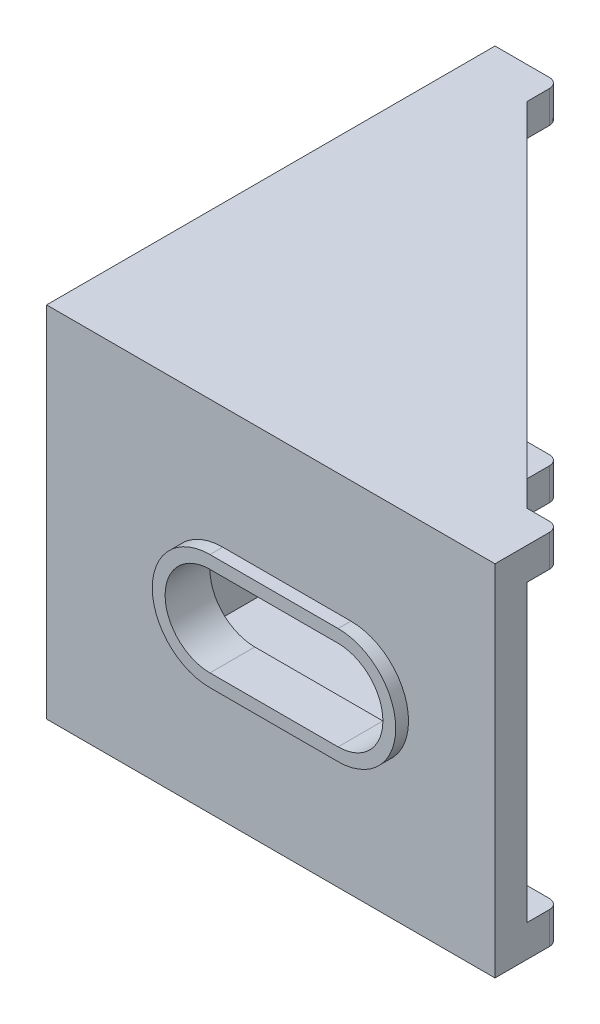
ISO-10303-21;
HEADER;
FILE_DESCRIPTION(('STEP AP214'),'2;1');
FILE_NAME('part.step','',(''),(''),'','','');
FILE_SCHEMA(('AUTOMOTIVE_DESIGN { 1 0 10303 214 1 1 1 1 }'));
ENDSEC;
DATA;
#1=APPLICATION_CONTEXT('core data for automotive mechanical design processes');
#2=APPLICATION_PROTOCOL_DEFINITION('international standard','automotive_design',2000,#1);
#3=PRODUCT_CONTEXT('',#1,'mechanical');
#4=PRODUCT('Part','Part','',(#3));
#5=PRODUCT_RELATED_PRODUCT_CATEGORY('part','',(#4));
#6=PRODUCT_DEFINITION_FORMATION('','',#4);
#7=PRODUCT_DEFINITION_CONTEXT('part definition',#1,'design');
#8=PRODUCT_DEFINITION('design','',#6,#7);
#9=PRODUCT_DEFINITION_SHAPE('','',#8);
#10=(LENGTH_UNIT() NAMED_UNIT(*) SI_UNIT(.MILLI.,.METRE.));
#11=(NAMED_UNIT(*) PLANE_ANGLE_UNIT() SI_UNIT($,.RADIAN.));
#12=(NAMED_UNIT(*) SI_UNIT($,.STERADIAN.) SOLID_ANGLE_UNIT());
#13=UNCERTAINTY_MEASURE_WITH_UNIT(LENGTH_MEASURE(1.E-05),#10,'distance_accuracy_value','');
#14=(GEOMETRIC_REPRESENTATION_CONTEXT(3) GLOBAL_UNCERTAINTY_ASSIGNED_CONTEXT((#13)) GLOBAL_UNIT_ASSIGNED_CONTEXT((#10,
#11,#12)) REPRESENTATION_CONTEXT('',''));
#15=CARTESIAN_POINT('',(0.,0.,0.));
#16=DIRECTION('',(0.,0.,1.));
#17=DIRECTION('',(1.,0.,0.));
#18=AXIS2_PLACEMENT_3D('',#15,#16,#17);
#19=CARTESIAN_POINT('',(0.,28.,0.));
#20=DIRECTION('',(0.,0.,-1.));
#21=DIRECTION('',(-1.,0.,0.));
#22=AXIS2_PLACEMENT_3D('',#19,#20,#21);
#23=PLANE('',#22);
#24=DIRECTION('',(1.,0.,0.));
#25=VECTOR('',#24,1.);
#26=CARTESIAN_POINT('',(0.,0.,0.));
#27=LINE('',#26,#25);
#28=CARTESIAN_POINT('',(0.,0.,0.));
#29=VERTEX_POINT('',#28);
#30=CARTESIAN_POINT('',(35.,0.,0.));
#31=VERTEX_POINT('',#30);
#32=EDGE_CURVE('E435',#29,#31,#27,.T.);
#33=ORIENTED_EDGE('',*,*,#32,.T.);
#34=DIRECTION('',(0.,-1.,0.));
#35=VECTOR('',#34,1.);
#36=CARTESIAN_POINT('',(35.,28.,0.));
#37=LINE('',#36,#35);
#38=CARTESIAN_POINT('',(35.,28.,0.));
#39=VERTEX_POINT('',#38);
#40=EDGE_CURVE('E11',#39,#31,#37,.T.);
#41=ORIENTED_EDGE('',*,*,#40,.F.);
#42=DIRECTION('',(1.,0.,0.));
#43=VECTOR('',#42,1.);
#44=CARTESIAN_POINT('',(0.,28.,0.));
#45=LINE('',#44,#43);
#46=CARTESIAN_POINT('',(0.,28.,0.));
#47=VERTEX_POINT('',#46);
#48=EDGE_CURVE('E446',#47,#39,#45,.T.);
#49=ORIENTED_EDGE('',*,*,#48,.F.);
#50=DIRECTION('',(0.,-1.,0.));
#51=VECTOR('',#50,1.);
#52=CARTESIAN_POINT('',(0.,28.,0.));
#53=LINE('',#52,#51);
#54=EDGE_CURVE('E456',#47,#29,#53,.T.);
#55=ORIENTED_EDGE('',*,*,#54,.T.);
#56=EDGE_LOOP('',(#33,#41,#49,#55));
#57=FACE_BOUND('',#56,.T.);
#58=CARTESIAN_POINT('',(13.75,14.,0.));
#59=DIRECTION('',(0.,0.,1.));
#60=DIRECTION('',(1.,0.,0.));
#61=AXIS2_PLACEMENT_3D('',#58,#59,#60);
#62=CIRCLE('',#61,4.5);
#63=CARTESIAN_POINT('',(13.75,18.5,0.));
#64=VERTEX_POINT('',#63);
#65=CARTESIAN_POINT('',(13.75,9.5,0.));
#66=VERTEX_POINT('',#65);
#67=EDGE_CURVE('E263',#64,#66,#62,.T.);
#68=ORIENTED_EDGE('',*,*,#67,.F.);
#69=DIRECTION('',(-1.,0.,0.));
#70=VECTOR('',#69,1.);
#71=CARTESIAN_POINT('',(13.75,18.5,0.));
#72=LINE('',#71,#70);
#73=CARTESIAN_POINT('',(23.75,18.5,0.));
#74=VERTEX_POINT('',#73);
#75=EDGE_CURVE('E268',#74,#64,#72,.T.);
#76=ORIENTED_EDGE('',*,*,#75,.F.);
#77=CARTESIAN_POINT('',(23.75,14.,0.));
#78=DIRECTION('',(0.,0.,1.));
#79=DIRECTION('',(1.,0.,0.));
#80=AXIS2_PLACEMENT_3D('',#77,#78,#79);
#81=CIRCLE('',#80,4.5);
#82=CARTESIAN_POINT('',(23.75,9.5,0.));
#83=VERTEX_POINT('',#82);
#84=EDGE_CURVE('E58',#83,#74,#81,.T.);
#85=ORIENTED_EDGE('',*,*,#84,.F.);
#86=DIRECTION('',(1.,0.,0.));
#87=VECTOR('',#86,1.);
#88=CARTESIAN_POINT('',(23.75,9.5,0.));
#89=LINE('',#88,#87);
#90=EDGE_CURVE('E53',#66,#83,#89,.T.);
#91=ORIENTED_EDGE('',*,*,#90,.F.);
#92=EDGE_LOOP('',(#68,#76,#85,#91));
#93=FACE_BOUND('',#92,.T.);
#94=ADVANCED_FACE('F39',(#57,#93),#23,.F.);
#95=CARTESIAN_POINT('',(2.5,28.,-2.5));
#96=DIRECTION('',(0.,0.,1.));
#97=DIRECTION('',(1.,0.,0.));
#98=AXIS2_PLACEMENT_3D('',#95,#96,#97);
#99=PLANE('',#98);
#100=DIRECTION('',(-1.,0.,0.));
#101=VECTOR('',#100,1.);
#102=CARTESIAN_POINT('',(23.75,10.5,-2.5));
#103=LINE('',#102,#101);
#104=CARTESIAN_POINT('',(23.75,10.5,-2.5));
#105=VERTEX_POINT('',#104);
#106=CARTESIAN_POINT('',(13.75,10.5,-2.5));
#107=VERTEX_POINT('',#106);
#108=EDGE_CURVE('E241',#105,#107,#103,.T.);
#109=ORIENTED_EDGE('',*,*,#108,.F.);
#110=CARTESIAN_POINT('',(23.75,14.,-2.5));
#111=DIRECTION('',(0.,0.,-1.));
#112=DIRECTION('',(-1.,0.,0.));
#113=AXIS2_PLACEMENT_3D('',#110,#111,#112);
#114=CIRCLE('',#113,3.5);
#115=CARTESIAN_POINT('',(23.75,17.5,-2.5));
#116=VERTEX_POINT('',#115);
#117=EDGE_CURVE('E317',#116,#105,#114,.T.);
#118=ORIENTED_EDGE('',*,*,#117,.F.);
#119=DIRECTION('',(1.,0.,0.));
#120=VECTOR('',#119,1.);
#121=CARTESIAN_POINT('',(23.75,17.5,-2.5));
#122=LINE('',#121,#120);
#123=CARTESIAN_POINT('',(13.75,17.5,-2.5));
#124=VERTEX_POINT('',#123);
#125=EDGE_CURVE('E328',#124,#116,#122,.T.);
#126=ORIENTED_EDGE('',*,*,#125,.F.);
#127=CARTESIAN_POINT('',(13.75,14.,-2.5));
#128=DIRECTION('',(0.,0.,-1.));
#129=DIRECTION('',(-1.,0.,0.));
#130=AXIS2_PLACEMENT_3D('',#127,#128,#129);
#131=CIRCLE('',#130,3.5);
#132=EDGE_CURVE('E326',#107,#124,#131,.T.);
#133=ORIENTED_EDGE('',*,*,#132,.F.);
#134=EDGE_LOOP('',(#109,#118,#126,#133));
#135=FACE_BOUND('',#134,.T.);
#136=DIRECTION('',(-1.,0.,0.));
#137=VECTOR('',#136,1.);
#138=CARTESIAN_POINT('',(0.,2.5,-2.5));
#139=LINE('',#138,#137);
#140=CARTESIAN_POINT('',(35.,2.5,-2.5));
#141=VERTEX_POINT('',#140);
#142=CARTESIAN_POINT('',(2.5,2.5,-2.5));
#143=VERTEX_POINT('',#142);
#144=EDGE_CURVE('E352',#141,#143,#139,.T.);
#145=ORIENTED_EDGE('',*,*,#144,.T.);
#146=DIRECTION('',(0.,-1.,0.));
#147=VECTOR('',#146,1.);
#148=CARTESIAN_POINT('',(2.5,28.,-2.5));
#149=LINE('',#148,#147);
#150=CARTESIAN_POINT('',(2.5,25.5,-2.5));
#151=VERTEX_POINT('',#150);
#152=EDGE_CURVE('E472',#151,#143,#149,.T.);
#153=ORIENTED_EDGE('',*,*,#152,.F.);
#154=DIRECTION('',(1.,0.,0.));
#155=VECTOR('',#154,1.);
#156=CARTESIAN_POINT('',(35.,25.5,-2.5));
#157=LINE('',#156,#155);
#158=CARTESIAN_POINT('',(35.,25.5,-2.5));
#159=VERTEX_POINT('',#158);
#160=EDGE_CURVE('E393',#151,#159,#157,.T.);
#161=ORIENTED_EDGE('',*,*,#160,.T.);
#162=DIRECTION('',(0.,-1.,0.));
#163=VECTOR('',#162,1.);
#164=CARTESIAN_POINT('',(35.,28.,-2.5));
#165=LINE('',#164,#163);
#166=EDGE_CURVE('E46',#159,#141,#165,.T.);
#167=ORIENTED_EDGE('',*,*,#166,.T.);
#168=EDGE_LOOP('',(#145,#153,#161,#167));
#169=FACE_BOUND('',#168,.T.);
#170=ADVANCED_FACE('F477',(#135,#169),#99,.F.);
#171=CARTESIAN_POINT('',(2.5,28.,-2.5));
#172=DIRECTION('',(-1.,0.,0.));
#173=DIRECTION('',(0.,0.,1.));
#174=AXIS2_PLACEMENT_3D('',#171,#172,#173);
#175=PLANE('',#174);
#176=DIRECTION('',(0.,0.,-1.));
#177=VECTOR('',#176,1.);
#178=CARTESIAN_POINT('',(2.5,10.5,-13.75));
#179=LINE('',#178,#177);
#180=CARTESIAN_POINT('',(2.5,10.5,-13.75));
#181=VERTEX_POINT('',#180);
#182=CARTESIAN_POINT('',(2.5,10.5,-23.75));
#183=VERTEX_POINT('',#182);
#184=EDGE_CURVE('E307',#181,#183,#179,.T.);
#185=ORIENTED_EDGE('',*,*,#184,.F.);
#186=CARTESIAN_POINT('',(2.5,14.,-13.75));
#187=DIRECTION('',(1.,0.,0.));
#188=DIRECTION('',(0.,0.,-1.));
#189=AXIS2_PLACEMENT_3D('',#186,#187,#188);
#190=CIRCLE('',#189,3.5);
#191=CARTESIAN_POINT('',(2.5,17.5,-13.75));
#192=VERTEX_POINT('',#191);
#193=EDGE_CURVE('E291',#192,#181,#190,.T.);
#194=ORIENTED_EDGE('',*,*,#193,.F.);
#195=DIRECTION('',(0.,0.,1.));
#196=VECTOR('',#195,1.);
#197=CARTESIAN_POINT('',(2.5,17.5,-13.75));
#198=LINE('',#197,#196);
#199=CARTESIAN_POINT('',(2.5,17.5,-23.75));
#200=VERTEX_POINT('',#199);
#201=EDGE_CURVE('E296',#200,#192,#198,.T.);
#202=ORIENTED_EDGE('',*,*,#201,.F.);
#203=CARTESIAN_POINT('',(2.5,14.,-23.75));
#204=DIRECTION('',(1.,0.,0.));
#205=DIRECTION('',(0.,0.,-1.));
#206=AXIS2_PLACEMENT_3D('',#203,#204,#205);
#207=CIRCLE('',#206,3.5);
#208=EDGE_CURVE('E310',#183,#200,#207,.T.);
#209=ORIENTED_EDGE('',*,*,#208,.F.);
#210=EDGE_LOOP('',(#185,#194,#202,#209));
#211=FACE_BOUND('',#210,.T.);
#212=DIRECTION('',(0.,0.,-1.));
#213=VECTOR('',#212,1.);
#214=CARTESIAN_POINT('',(2.5,2.5,0.));
#215=LINE('',#214,#213);
#216=CARTESIAN_POINT('',(2.5,2.5,-35.));
#217=VERTEX_POINT('',#216);
#218=EDGE_CURVE('E354',#143,#217,#215,.T.);
#219=ORIENTED_EDGE('',*,*,#218,.T.);
#220=DIRECTION('',(0.,-1.,0.));
#221=VECTOR('',#220,1.);
#222=CARTESIAN_POINT('',(2.5,28.,-35.));
#223=LINE('',#222,#221);
#224=CARTESIAN_POINT('',(2.5,25.5,-35.));
#225=VERTEX_POINT('',#224);
#226=EDGE_CURVE('E469',#225,#217,#223,.T.);
#227=ORIENTED_EDGE('',*,*,#226,.F.);
#228=DIRECTION('',(0.,0.,1.));
#229=VECTOR('',#228,1.);
#230=CARTESIAN_POINT('',(2.5,25.5,-2.5));
#231=LINE('',#230,#229);
#232=EDGE_CURVE('E390',#225,#151,#231,.T.);
#233=ORIENTED_EDGE('',*,*,#232,.T.);
#234=ORIENTED_EDGE('',*,*,#152,.T.);
#235=EDGE_LOOP('',(#219,#227,#233,#234));
#236=FACE_BOUND('',#235,.T.);
#237=ADVANCED_FACE('F514',(#211,#236),#175,.F.);
#238=CARTESIAN_POINT('',(35.,28.,-2.5));
#239=DIRECTION('',(-1.,0.,0.));
#240=DIRECTION('',(0.,0.,1.));
#241=AXIS2_PLACEMENT_3D('',#238,#239,#240);
#242=PLANE('',#241);
#243=DIRECTION('',(0.,0.,-1.));
#244=VECTOR('',#243,1.);
#245=CARTESIAN_POINT('',(35.,0.,-2.5));
#246=LINE('',#245,#244);
#247=CARTESIAN_POINT('',(35.,0.,-4.24999999999999));
#248=VERTEX_POINT('',#247);
#249=EDGE_CURVE('E459',#31,#248,#246,.T.);
#250=ORIENTED_EDGE('',*,*,#249,.T.);
#251=DIRECTION('',(0.,-1.,0.));
#252=VECTOR('',#251,1.);
#253=CARTESIAN_POINT('',(35.,2.5,-4.24999999999999));
#254=LINE('',#253,#252);
#255=CARTESIAN_POINT('',(35.,2.5,-4.24999999999999));
#256=VERTEX_POINT('',#255);
#257=EDGE_CURVE('E382',#256,#248,#254,.T.);
#258=ORIENTED_EDGE('',*,*,#257,.F.);
#259=DIRECTION('',(0.,0.,1.));
#260=VECTOR('',#259,1.);
#261=CARTESIAN_POINT('',(35.,2.5,0.));
#262=LINE('',#261,#260);
#263=EDGE_CURVE('E349',#256,#141,#262,.T.);
#264=ORIENTED_EDGE('',*,*,#263,.T.);
#265=ORIENTED_EDGE('',*,*,#166,.F.);
#266=DIRECTION('',(0.,0.,-1.));
#267=VECTOR('',#266,1.);
#268=CARTESIAN_POINT('',(35.,25.5,-4.24999999999999));
#269=LINE('',#268,#267);
#270=CARTESIAN_POINT('',(35.,25.5,-4.24999999999999));
#271=VERTEX_POINT('',#270);
#272=EDGE_CURVE('E397',#159,#271,#269,.T.);
#273=ORIENTED_EDGE('',*,*,#272,.T.);
#274=DIRECTION('',(0.,1.,0.));
#275=VECTOR('',#274,1.);
#276=CARTESIAN_POINT('',(35.,25.5,-4.24999999999999));
#277=LINE('',#276,#275);
#278=CARTESIAN_POINT('',(35.,28.,-4.24999999999999));
#279=VERTEX_POINT('',#278);
#280=EDGE_CURVE('E418',#271,#279,#277,.T.);
#281=ORIENTED_EDGE('',*,*,#280,.T.);
#282=DIRECTION('',(0.,0.,-1.));
#283=VECTOR('',#282,1.);
#284=CARTESIAN_POINT('',(35.,28.,-2.5));
#285=LINE('',#284,#283);
#286=EDGE_CURVE('E449',#39,#279,#285,.T.);
#287=ORIENTED_EDGE('',*,*,#286,.F.);
#288=ORIENTED_EDGE('',*,*,#40,.T.);
#289=EDGE_LOOP('',(#250,#258,#264,#265,#273,#281,#287,#288));
#290=FACE_BOUND('',#289,.T.);
#291=ADVANCED_FACE('F487',(#290),#242,.F.);
#292=CARTESIAN_POINT('',(0.,28.,-35.));
#293=DIRECTION('',(0.,0.,1.));
#294=DIRECTION('',(1.,0.,0.));
#295=AXIS2_PLACEMENT_3D('',#292,#293,#294);
#296=PLANE('',#295);
#297=DIRECTION('',(-1.,0.,0.));
#298=VECTOR('',#297,1.);
#299=CARTESIAN_POINT('',(0.,0.,-35.));
#300=LINE('',#299,#298);
#301=CARTESIAN_POINT('',(4.24999999999999,0.,-35.));
#302=VERTEX_POINT('',#301);
#303=CARTESIAN_POINT('',(0.,0.,-35.));
#304=VERTEX_POINT('',#303);
#305=EDGE_CURVE('E461',#302,#304,#300,.T.);
#306=ORIENTED_EDGE('',*,*,#305,.T.);
#307=DIRECTION('',(0.,-1.,0.));
#308=VECTOR('',#307,1.);
#309=CARTESIAN_POINT('',(0.,28.,-35.));
#310=LINE('',#309,#308);
#311=CARTESIAN_POINT('',(0.,28.,-35.));
#312=VERTEX_POINT('',#311);
#313=EDGE_CURVE('E466',#312,#304,#310,.T.);
#314=ORIENTED_EDGE('',*,*,#313,.F.);
#315=DIRECTION('',(-1.,0.,0.));
#316=VECTOR('',#315,1.);
#317=CARTESIAN_POINT('',(0.,28.,-35.));
#318=LINE('',#317,#316);
#319=CARTESIAN_POINT('',(4.24999999999999,28.,-35.));
#320=VERTEX_POINT('',#319);
#321=EDGE_CURVE('E452',#320,#312,#318,.T.);
#322=ORIENTED_EDGE('',*,*,#321,.F.);
#323=DIRECTION('',(0.,1.,0.));
#324=VECTOR('',#323,1.);
#325=CARTESIAN_POINT('',(4.24999999999999,25.5,-35.));
#326=LINE('',#325,#324);
#327=CARTESIAN_POINT('',(4.24999999999999,25.5,-35.));
#328=VERTEX_POINT('',#327);
#329=EDGE_CURVE('E432',#328,#320,#326,.T.);
#330=ORIENTED_EDGE('',*,*,#329,.F.);
#331=DIRECTION('',(-1.,0.,0.));
#332=VECTOR('',#331,1.);
#333=CARTESIAN_POINT('',(2.5,25.5,-35.));
#334=LINE('',#333,#332);
#335=EDGE_CURVE('E415',#328,#225,#334,.T.);
#336=ORIENTED_EDGE('',*,*,#335,.T.);
#337=ORIENTED_EDGE('',*,*,#226,.T.);
#338=DIRECTION('',(1.,0.,0.));
#339=VECTOR('',#338,1.);
#340=CARTESIAN_POINT('',(0.,2.5,-35.));
#341=LINE('',#340,#339);
#342=CARTESIAN_POINT('',(4.24999999999999,2.5,-35.));
#343=VERTEX_POINT('',#342);
#344=EDGE_CURVE('E356',#217,#343,#341,.T.);
#345=ORIENTED_EDGE('',*,*,#344,.T.);
#346=DIRECTION('',(0.,-1.,0.));
#347=VECTOR('',#346,1.);
#348=CARTESIAN_POINT('',(4.24999999999999,2.5,-35.));
#349=LINE('',#348,#347);
#350=EDGE_CURVE('E379',#343,#302,#349,.T.);
#351=ORIENTED_EDGE('',*,*,#350,.T.);
#352=EDGE_LOOP('',(#306,#314,#322,#330,#336,#337,#345,#351));
#353=FACE_BOUND('',#352,.T.);
#354=ADVANCED_FACE('F510',(#353),#296,.F.);
#355=CARTESIAN_POINT('',(0.,28.,0.));
#356=DIRECTION('',(1.,0.,0.));
#357=DIRECTION('',(0.,0.,-1.));
#358=AXIS2_PLACEMENT_3D('',#355,#356,#357);
#359=PLANE('',#358);
#360=DIRECTION('',(0.,0.,1.));
#361=VECTOR('',#360,1.);
#362=CARTESIAN_POINT('',(0.,17.5,-13.75));
#363=LINE('',#362,#361);
#364=CARTESIAN_POINT('',(0.,17.5,-23.75));
#365=VERTEX_POINT('',#364);
#366=CARTESIAN_POINT('',(0.,17.5,-13.75));
#367=VERTEX_POINT('',#366);
#368=EDGE_CURVE('E302',#365,#367,#363,.T.);
#369=ORIENTED_EDGE('',*,*,#368,.T.);
#370=CARTESIAN_POINT('',(0.,14.,-13.75));
#371=DIRECTION('',(1.,0.,0.));
#372=DIRECTION('',(0.,0.,-1.));
#373=AXIS2_PLACEMENT_3D('',#370,#371,#372);
#374=CIRCLE('',#373,3.5);
#375=CARTESIAN_POINT('',(0.,10.5,-13.75));
#376=VERTEX_POINT('',#375);
#377=EDGE_CURVE('E292',#367,#376,#374,.T.);
#378=ORIENTED_EDGE('',*,*,#377,.T.);
#379=DIRECTION('',(0.,0.,-1.));
#380=VECTOR('',#379,1.);
#381=CARTESIAN_POINT('',(0.,10.5,-13.75));
#382=LINE('',#381,#380);
#383=CARTESIAN_POINT('',(0.,10.5,-23.75));
#384=VERTEX_POINT('',#383);
#385=EDGE_CURVE('E295',#376,#384,#382,.T.);
#386=ORIENTED_EDGE('',*,*,#385,.T.);
#387=CARTESIAN_POINT('',(0.,14.,-23.75));
#388=DIRECTION('',(1.,0.,0.));
#389=DIRECTION('',(0.,0.,-1.));
#390=AXIS2_PLACEMENT_3D('',#387,#388,#389);
#391=CIRCLE('',#390,3.5);
#392=EDGE_CURVE('E299',#384,#365,#391,.T.);
#393=ORIENTED_EDGE('',*,*,#392,.T.);
#394=EDGE_LOOP('',(#369,#378,#386,#393));
#395=FACE_BOUND('',#394,.T.);
#396=DIRECTION('',(0.,0.,1.));
#397=VECTOR('',#396,1.);
#398=CARTESIAN_POINT('',(0.,0.,0.));
#399=LINE('',#398,#397);
#400=EDGE_CURVE('E450',#304,#29,#399,.T.);
#401=ORIENTED_EDGE('',*,*,#400,.T.);
#402=ORIENTED_EDGE('',*,*,#54,.F.);
#403=DIRECTION('',(0.,0.,1.));
#404=VECTOR('',#403,1.);
#405=CARTESIAN_POINT('',(0.,28.,0.));
#406=LINE('',#405,#404);
#407=EDGE_CURVE('E454',#312,#47,#406,.T.);
#408=ORIENTED_EDGE('',*,*,#407,.F.);
#409=ORIENTED_EDGE('',*,*,#313,.T.);
#410=EDGE_LOOP('',(#401,#402,#408,#409));
#411=FACE_BOUND('',#410,.T.);
#412=ADVANCED_FACE('F533',(#395,#411),#359,.F.);
#413=CARTESIAN_POINT('',(0.,28.,0.));
#414=DIRECTION('',(0.,-1.,0.));
#415=DIRECTION('',(0.,0.,-1.));
#416=AXIS2_PLACEMENT_3D('',#413,#414,#415);
#417=PLANE('',#416);
#418=CARTESIAN_POINT('',(4.25,28.,-34.25));
#419=DIRECTION('',(0.,1.,0.));
#420=DIRECTION('',(0.,0.,-1.));
#421=AXIS2_PLACEMENT_3D('',#418,#419,#420);
#422=CIRCLE('',#421,0.75);
#423=CARTESIAN_POINT('',(5.,28.,-34.25));
#424=VERTEX_POINT('',#423);
#425=EDGE_CURVE('E394',#424,#320,#422,.T.);
#426=ORIENTED_EDGE('',*,*,#425,.T.);
#427=ORIENTED_EDGE('',*,*,#321,.T.);
#428=ORIENTED_EDGE('',*,*,#407,.T.);
#429=ORIENTED_EDGE('',*,*,#48,.T.);
#430=ORIENTED_EDGE('',*,*,#286,.T.);
#431=CARTESIAN_POINT('',(34.25,28.,-4.25));
#432=DIRECTION('',(0.,1.,0.));
#433=DIRECTION('',(0.,0.,-1.));
#434=AXIS2_PLACEMENT_3D('',#431,#432,#433);
#435=CIRCLE('',#434,0.75);
#436=CARTESIAN_POINT('',(34.25,28.,-5.));
#437=VERTEX_POINT('',#436);
#438=EDGE_CURVE('E378',#279,#437,#435,.T.);
#439=ORIENTED_EDGE('',*,*,#438,.T.);
#440=DIRECTION('',(-1.,0.,0.));
#441=VECTOR('',#440,1.);
#442=CARTESIAN_POINT('',(32.5,28.,-5.));
#443=LINE('',#442,#441);
#444=CARTESIAN_POINT('',(32.5,28.,-5.));
#445=VERTEX_POINT('',#444);
#446=EDGE_CURVE('E421',#437,#445,#443,.T.);
#447=ORIENTED_EDGE('',*,*,#446,.T.);
#448=DIRECTION('',(-0.707106781186544,0.,-0.707106781186551));
#449=VECTOR('',#448,1.);
#450=CARTESIAN_POINT('',(5.,28.,-32.5000000000002));
#451=LINE('',#450,#449);
#452=CARTESIAN_POINT('',(5.,28.,-32.5000000000002));
#453=VERTEX_POINT('',#452);
#454=EDGE_CURVE('E424',#445,#453,#451,.T.);
#455=ORIENTED_EDGE('',*,*,#454,.T.);
#456=DIRECTION('',(0.,0.,-1.));
#457=VECTOR('',#456,1.);
#458=CARTESIAN_POINT('',(5.,28.,-34.25));
#459=LINE('',#458,#457);
#460=EDGE_CURVE('E427',#453,#424,#459,.T.);
#461=ORIENTED_EDGE('',*,*,#460,.T.);
#462=EDGE_LOOP('',(#426,#427,#428,#429,#430,#439,#447,#455,#461));
#463=FACE_BOUND('',#462,.T.);
#464=ADVANCED_FACE('F525',(#463),#417,.F.);
#465=CARTESIAN_POINT('',(0.,0.,0.));
#466=DIRECTION('',(0.,-1.,0.));
#467=DIRECTION('',(0.,0.,-1.));
#468=AXIS2_PLACEMENT_3D('',#465,#466,#467);
#469=PLANE('',#468);
#470=ORIENTED_EDGE('',*,*,#305,.F.);
#471=CARTESIAN_POINT('',(4.25,0.,-34.25));
#472=DIRECTION('',(0.,-1.,0.));
#473=DIRECTION('',(0.,0.,-1.));
#474=AXIS2_PLACEMENT_3D('',#471,#472,#473);
#475=CIRCLE('',#474,0.75);
#476=CARTESIAN_POINT('',(5.,0.,-34.25));
#477=VERTEX_POINT('',#476);
#478=EDGE_CURVE('E340',#302,#477,#475,.T.);
#479=ORIENTED_EDGE('',*,*,#478,.T.);
#480=DIRECTION('',(0.,0.,1.));
#481=VECTOR('',#480,1.);
#482=CARTESIAN_POINT('',(5.,0.,0.));
#483=LINE('',#482,#481);
#484=CARTESIAN_POINT('',(5.,0.,-32.5000000000002));
#485=VERTEX_POINT('',#484);
#486=EDGE_CURVE('E333',#477,#485,#483,.T.);
#487=ORIENTED_EDGE('',*,*,#486,.T.);
#488=DIRECTION('',(0.707106781186544,0.,0.707106781186551));
#489=VECTOR('',#488,1.);
#490=CARTESIAN_POINT('',(18.7500000000001,0.,-18.75));
#491=LINE('',#490,#489);
#492=CARTESIAN_POINT('',(32.5,0.,-5.));
#493=VERTEX_POINT('',#492);
#494=EDGE_CURVE('E365',#485,#493,#491,.T.);
#495=ORIENTED_EDGE('',*,*,#494,.T.);
#496=DIRECTION('',(1.,0.,0.));
#497=VECTOR('',#496,1.);
#498=CARTESIAN_POINT('',(0.,0.,-5.));
#499=LINE('',#498,#497);
#500=CARTESIAN_POINT('',(34.25,0.,-5.));
#501=VERTEX_POINT('',#500);
#502=EDGE_CURVE('E368',#493,#501,#499,.T.);
#503=ORIENTED_EDGE('',*,*,#502,.T.);
#504=CARTESIAN_POINT('',(34.25,0.,-4.25));
#505=DIRECTION('',(0.,-1.,0.));
#506=DIRECTION('',(0.,0.,-1.));
#507=AXIS2_PLACEMENT_3D('',#504,#505,#506);
#508=CIRCLE('',#507,0.75);
#509=EDGE_CURVE('E371',#501,#248,#508,.T.);
#510=ORIENTED_EDGE('',*,*,#509,.T.);
#511=ORIENTED_EDGE('',*,*,#249,.F.);
#512=ORIENTED_EDGE('',*,*,#32,.F.);
#513=ORIENTED_EDGE('',*,*,#400,.F.);
#514=EDGE_LOOP('',(#470,#479,#487,#495,#503,#510,#511,#512,#513));
#515=FACE_BOUND('',#514,.T.);
#516=ADVANCED_FACE('F492',(#515),#469,.T.);
#517=CARTESIAN_POINT('',(4.25,25.5,-34.25));
#518=DIRECTION('',(0.,1.,0.));
#519=DIRECTION('',(0.,0.,1.));
#520=AXIS2_PLACEMENT_3D('',#517,#518,#519);
#521=CYLINDRICAL_SURFACE('',#520,0.75);
#522=ORIENTED_EDGE('',*,*,#425,.F.);
#523=DIRECTION('',(0.,1.,0.));
#524=VECTOR('',#523,1.);
#525=CARTESIAN_POINT('',(5.,25.5,-34.25));
#526=LINE('',#525,#524);
#527=CARTESIAN_POINT('',(5.,25.5,-34.25));
#528=VERTEX_POINT('',#527);
#529=EDGE_CURVE('E436',#528,#424,#526,.T.);
#530=ORIENTED_EDGE('',*,*,#529,.F.);
#531=CARTESIAN_POINT('',(4.25,25.5,-34.25));
#532=DIRECTION('',(0.,1.,0.));
#533=DIRECTION('',(0.,0.,-1.));
#534=AXIS2_PLACEMENT_3D('',#531,#532,#533);
#535=CIRCLE('',#534,0.75);
#536=EDGE_CURVE('E412',#528,#328,#535,.T.);
#537=ORIENTED_EDGE('',*,*,#536,.T.);
#538=ORIENTED_EDGE('',*,*,#329,.T.);
#539=EDGE_LOOP('',(#522,#530,#537,#538));
#540=FACE_BOUND('',#539,.T.);
#541=ADVANCED_FACE('F537',(#540),#521,.T.);
#542=CARTESIAN_POINT('',(5.,25.5,-34.25));
#543=DIRECTION('',(1.,0.,0.));
#544=DIRECTION('',(0.,0.,-1.));
#545=AXIS2_PLACEMENT_3D('',#542,#543,#544);
#546=PLANE('',#545);
#547=ORIENTED_EDGE('',*,*,#460,.F.);
#548=DIRECTION('',(0.,1.,0.));
#549=VECTOR('',#548,1.);
#550=CARTESIAN_POINT('',(5.,25.5,-32.5000000000002));
#551=LINE('',#550,#549);
#552=CARTESIAN_POINT('',(5.,25.5,-32.5000000000002));
#553=VERTEX_POINT('',#552);
#554=EDGE_CURVE('E438',#553,#453,#551,.T.);
#555=ORIENTED_EDGE('',*,*,#554,.F.);
#556=DIRECTION('',(0.,0.,-1.));
#557=VECTOR('',#556,1.);
#558=CARTESIAN_POINT('',(5.,25.5,-34.25));
#559=LINE('',#558,#557);
#560=EDGE_CURVE('E409',#553,#528,#559,.T.);
#561=ORIENTED_EDGE('',*,*,#560,.T.);
#562=ORIENTED_EDGE('',*,*,#529,.T.);
#563=EDGE_LOOP('',(#547,#555,#561,#562));
#564=FACE_BOUND('',#563,.T.);
#565=ADVANCED_FACE('F541',(#564),#546,.T.);
#566=CARTESIAN_POINT('',(5.,25.5,-32.5000000000002));
#567=DIRECTION('',(0.707106781186551,0.,-0.707106781186544));
#568=DIRECTION('',(-0.707106781186544,0.,-0.707106781186551));
#569=AXIS2_PLACEMENT_3D('',#566,#567,#568);
#570=PLANE('',#569);
#571=ORIENTED_EDGE('',*,*,#454,.F.);
#572=DIRECTION('',(0.,1.,0.));
#573=VECTOR('',#572,1.);
#574=CARTESIAN_POINT('',(32.5,25.5,-5.));
#575=LINE('',#574,#573);
#576=CARTESIAN_POINT('',(32.5,25.5,-5.));
#577=VERTEX_POINT('',#576);
#578=EDGE_CURVE('E440',#577,#445,#575,.T.);
#579=ORIENTED_EDGE('',*,*,#578,.F.);
#580=DIRECTION('',(-0.707106781186544,0.,-0.707106781186551));
#581=VECTOR('',#580,1.);
#582=CARTESIAN_POINT('',(5.,25.5,-32.5000000000002));
#583=LINE('',#582,#581);
#584=EDGE_CURVE('E406',#577,#553,#583,.T.);
#585=ORIENTED_EDGE('',*,*,#584,.T.);
#586=ORIENTED_EDGE('',*,*,#554,.T.);
#587=EDGE_LOOP('',(#571,#579,#585,#586));
#588=FACE_BOUND('',#587,.T.);
#589=ADVANCED_FACE('F545',(#588),#570,.T.);
#590=CARTESIAN_POINT('',(32.5,25.5,-5.));
#591=DIRECTION('',(0.,0.,-1.));
#592=DIRECTION('',(-1.,0.,0.));
#593=AXIS2_PLACEMENT_3D('',#590,#591,#592);
#594=PLANE('',#593);
#595=ORIENTED_EDGE('',*,*,#446,.F.);
#596=DIRECTION('',(0.,1.,0.));
#597=VECTOR('',#596,1.);
#598=CARTESIAN_POINT('',(34.25,25.5,-5.));
#599=LINE('',#598,#597);
#600=CARTESIAN_POINT('',(34.25,25.5,-5.));
#601=VERTEX_POINT('',#600);
#602=EDGE_CURVE('E442',#601,#437,#599,.T.);
#603=ORIENTED_EDGE('',*,*,#602,.F.);
#604=DIRECTION('',(-1.,0.,0.));
#605=VECTOR('',#604,1.);
#606=CARTESIAN_POINT('',(32.5,25.5,-5.));
#607=LINE('',#606,#605);
#608=EDGE_CURVE('E403',#601,#577,#607,.T.);
#609=ORIENTED_EDGE('',*,*,#608,.T.);
#610=ORIENTED_EDGE('',*,*,#578,.T.);
#611=EDGE_LOOP('',(#595,#603,#609,#610));
#612=FACE_BOUND('',#611,.T.);
#613=ADVANCED_FACE('F547',(#612),#594,.T.);
#614=CARTESIAN_POINT('',(34.25,25.5,-4.25));
#615=DIRECTION('',(0.,1.,0.));
#616=DIRECTION('',(0.,0.,1.));
#617=AXIS2_PLACEMENT_3D('',#614,#615,#616);
#618=CYLINDRICAL_SURFACE('',#617,0.75);
#619=ORIENTED_EDGE('',*,*,#438,.F.);
#620=ORIENTED_EDGE('',*,*,#280,.F.);
#621=CARTESIAN_POINT('',(34.25,25.5,-4.25));
#622=DIRECTION('',(0.,1.,0.));
#623=DIRECTION('',(0.,0.,-1.));
#624=AXIS2_PLACEMENT_3D('',#621,#622,#623);
#625=CIRCLE('',#624,0.75);
#626=EDGE_CURVE('E400',#271,#601,#625,.T.);
#627=ORIENTED_EDGE('',*,*,#626,.T.);
#628=ORIENTED_EDGE('',*,*,#602,.T.);
#629=EDGE_LOOP('',(#619,#620,#627,#628));
#630=FACE_BOUND('',#629,.T.);
#631=ADVANCED_FACE('F522',(#630),#618,.T.);
#632=CARTESIAN_POINT('',(4.25,25.5,-34.25));
#633=DIRECTION('',(0.,-1.,0.));
#634=DIRECTION('',(0.,0.,-1.));
#635=AXIS2_PLACEMENT_3D('',#632,#633,#634);
#636=PLANE('',#635);
#637=ORIENTED_EDGE('',*,*,#232,.F.);
#638=ORIENTED_EDGE('',*,*,#335,.F.);
#639=ORIENTED_EDGE('',*,*,#536,.F.);
#640=ORIENTED_EDGE('',*,*,#560,.F.);
#641=ORIENTED_EDGE('',*,*,#584,.F.);
#642=ORIENTED_EDGE('',*,*,#608,.F.);
#643=ORIENTED_EDGE('',*,*,#626,.F.);
#644=ORIENTED_EDGE('',*,*,#272,.F.);
#645=ORIENTED_EDGE('',*,*,#160,.F.);
#646=EDGE_LOOP('',(#637,#638,#639,#640,#641,#642,#643,#644,#645));
#647=FACE_BOUND('',#646,.T.);
#648=ADVANCED_FACE('F516',(#647),#636,.T.);
#649=CARTESIAN_POINT('',(5.,2.5,0.));
#650=DIRECTION('',(1.,0.,0.));
#651=DIRECTION('',(0.,0.,-1.));
#652=AXIS2_PLACEMENT_3D('',#649,#650,#651);
#653=PLANE('',#652);
#654=ORIENTED_EDGE('',*,*,#486,.F.);
#655=DIRECTION('',(0.,-1.,0.));
#656=VECTOR('',#655,1.);
#657=CARTESIAN_POINT('',(5.,2.5,-34.25));
#658=LINE('',#657,#656);
#659=CARTESIAN_POINT('',(5.,2.5,-34.25));
#660=VERTEX_POINT('',#659);
#661=EDGE_CURVE('E376',#660,#477,#658,.T.);
#662=ORIENTED_EDGE('',*,*,#661,.F.);
#663=DIRECTION('',(0.,0.,1.));
#664=VECTOR('',#663,1.);
#665=CARTESIAN_POINT('',(5.,2.5,0.));
#666=LINE('',#665,#664);
#667=CARTESIAN_POINT('',(5.,2.5,-32.5000000000002));
#668=VERTEX_POINT('',#667);
#669=EDGE_CURVE('E336',#660,#668,#666,.T.);
#670=ORIENTED_EDGE('',*,*,#669,.T.);
#671=DIRECTION('',(0.,-1.,0.));
#672=VECTOR('',#671,1.);
#673=CARTESIAN_POINT('',(5.,2.5,-32.5000000000002));
#674=LINE('',#673,#672);
#675=EDGE_CURVE('E362',#668,#485,#674,.T.);
#676=ORIENTED_EDGE('',*,*,#675,.T.);
#677=EDGE_LOOP('',(#654,#662,#670,#676));
#678=FACE_BOUND('',#677,.T.);
#679=ADVANCED_FACE('F504',(#678),#653,.T.);
#680=CARTESIAN_POINT('',(4.25,2.5,-34.25));
#681=DIRECTION('',(0.,-1.,0.));
#682=DIRECTION('',(0.,0.,-1.));
#683=AXIS2_PLACEMENT_3D('',#680,#681,#682);
#684=CYLINDRICAL_SURFACE('',#683,0.75);
#685=ORIENTED_EDGE('',*,*,#478,.F.);
#686=ORIENTED_EDGE('',*,*,#350,.F.);
#687=CARTESIAN_POINT('',(4.25,2.5,-34.25));
#688=DIRECTION('',(0.,-1.,0.));
#689=DIRECTION('',(0.,0.,-1.));
#690=AXIS2_PLACEMENT_3D('',#687,#688,#689);
#691=CIRCLE('',#690,0.75);
#692=EDGE_CURVE('E359',#343,#660,#691,.T.);
#693=ORIENTED_EDGE('',*,*,#692,.T.);
#694=ORIENTED_EDGE('',*,*,#661,.T.);
#695=EDGE_LOOP('',(#685,#686,#693,#694));
#696=FACE_BOUND('',#695,.T.);
#697=ADVANCED_FACE('F508',(#696),#684,.T.);
#698=CARTESIAN_POINT('',(34.25,2.5,-4.25));
#699=DIRECTION('',(0.,-1.,0.));
#700=DIRECTION('',(0.,0.,-1.));
#701=AXIS2_PLACEMENT_3D('',#698,#699,#700);
#702=CYLINDRICAL_SURFACE('',#701,0.75);
#703=ORIENTED_EDGE('',*,*,#509,.F.);
#704=DIRECTION('',(0.,-1.,0.));
#705=VECTOR('',#704,1.);
#706=CARTESIAN_POINT('',(34.25,2.5,-5.));
#707=LINE('',#706,#705);
#708=CARTESIAN_POINT('',(34.25,2.5,-5.));
#709=VERTEX_POINT('',#708);
#710=EDGE_CURVE('E385',#709,#501,#707,.T.);
#711=ORIENTED_EDGE('',*,*,#710,.F.);
#712=CARTESIAN_POINT('',(34.25,2.5,-4.25));
#713=DIRECTION('',(0.,-1.,0.));
#714=DIRECTION('',(0.,0.,-1.));
#715=AXIS2_PLACEMENT_3D('',#712,#713,#714);
#716=CIRCLE('',#715,0.75);
#717=EDGE_CURVE('E346',#709,#256,#716,.T.);
#718=ORIENTED_EDGE('',*,*,#717,.T.);
#719=ORIENTED_EDGE('',*,*,#257,.T.);
#720=EDGE_LOOP('',(#703,#711,#718,#719));
#721=FACE_BOUND('',#720,.T.);
#722=ADVANCED_FACE('F490',(#721),#702,.T.);
#723=CARTESIAN_POINT('',(0.,2.5,-5.));
#724=DIRECTION('',(0.,0.,-1.));
#725=DIRECTION('',(-1.,0.,0.));
#726=AXIS2_PLACEMENT_3D('',#723,#724,#725);
#727=PLANE('',#726);
#728=ORIENTED_EDGE('',*,*,#502,.F.);
#729=DIRECTION('',(0.,-1.,0.));
#730=VECTOR('',#729,1.);
#731=CARTESIAN_POINT('',(32.5,2.5,-5.));
#732=LINE('',#731,#730);
#733=CARTESIAN_POINT('',(32.5,2.5,-5.));
#734=VERTEX_POINT('',#733);
#735=EDGE_CURVE('E387',#734,#493,#732,.T.);
#736=ORIENTED_EDGE('',*,*,#735,.F.);
#737=DIRECTION('',(1.,0.,0.));
#738=VECTOR('',#737,1.);
#739=CARTESIAN_POINT('',(0.,2.5,-5.));
#740=LINE('',#739,#738);
#741=EDGE_CURVE('E343',#734,#709,#740,.T.);
#742=ORIENTED_EDGE('',*,*,#741,.T.);
#743=ORIENTED_EDGE('',*,*,#710,.T.);
#744=EDGE_LOOP('',(#728,#736,#742,#743));
#745=FACE_BOUND('',#744,.T.);
#746=ADVANCED_FACE('F497',(#745),#727,.T.);
#747=CARTESIAN_POINT('',(18.7500000000001,2.5,-18.75));
#748=DIRECTION('',(0.707106781186551,0.,-0.707106781186544));
#749=DIRECTION('',(-0.707106781186544,0.,-0.707106781186551));
#750=AXIS2_PLACEMENT_3D('',#747,#748,#749);
#751=PLANE('',#750);
#752=ORIENTED_EDGE('',*,*,#494,.F.);
#753=ORIENTED_EDGE('',*,*,#675,.F.);
#754=DIRECTION('',(0.707106781186544,0.,0.707106781186551));
#755=VECTOR('',#754,1.);
#756=CARTESIAN_POINT('',(18.7500000000001,2.5,-18.75));
#757=LINE('',#756,#755);
#758=EDGE_CURVE('E339',#668,#734,#757,.T.);
#759=ORIENTED_EDGE('',*,*,#758,.T.);
#760=ORIENTED_EDGE('',*,*,#735,.T.);
#761=EDGE_LOOP('',(#752,#753,#759,#760));
#762=FACE_BOUND('',#761,.T.);
#763=ADVANCED_FACE('F501',(#762),#751,.T.);
#764=CARTESIAN_POINT('',(34.25,2.5,-4.25));
#765=DIRECTION('',(0.,-1.,0.));
#766=DIRECTION('',(0.,0.,-1.));
#767=AXIS2_PLACEMENT_3D('',#764,#765,#766);
#768=PLANE('',#767);
#769=ORIENTED_EDGE('',*,*,#669,.F.);
#770=ORIENTED_EDGE('',*,*,#692,.F.);
#771=ORIENTED_EDGE('',*,*,#344,.F.);
#772=ORIENTED_EDGE('',*,*,#218,.F.);
#773=ORIENTED_EDGE('',*,*,#144,.F.);
#774=ORIENTED_EDGE('',*,*,#263,.F.);
#775=ORIENTED_EDGE('',*,*,#717,.F.);
#776=ORIENTED_EDGE('',*,*,#741,.F.);
#777=ORIENTED_EDGE('',*,*,#758,.F.);
#778=EDGE_LOOP('',(#769,#770,#771,#772,#773,#774,#775,#776,#777));
#779=FACE_BOUND('',#778,.T.);
#780=ADVANCED_FACE('F484',(#779),#768,.F.);
#781=CARTESIAN_POINT('',(23.75,14.,0.));
#782=DIRECTION('',(0.,0.,-1.));
#783=DIRECTION('',(-1.,0.,0.));
#784=AXIS2_PLACEMENT_3D('',#781,#782,#783);
#785=CYLINDRICAL_SURFACE('',#784,3.5);
#786=ORIENTED_EDGE('',*,*,#117,.T.);
#787=DIRECTION('',(0.,0.,-1.));
#788=VECTOR('',#787,1.);
#789=CARTESIAN_POINT('',(23.75,10.5,0.));
#790=LINE('',#789,#788);
#791=CARTESIAN_POINT('',(23.75,10.5,1.));
#792=VERTEX_POINT('',#791);
#793=EDGE_CURVE('E246',#792,#105,#790,.T.);
#794=ORIENTED_EDGE('',*,*,#793,.F.);
#795=CARTESIAN_POINT('',(23.75,14.,1.));
#796=DIRECTION('',(0.,0.,1.));
#797=DIRECTION('',(1.,0.,0.));
#798=AXIS2_PLACEMENT_3D('',#795,#796,#797);
#799=CIRCLE('',#798,3.5);
#800=CARTESIAN_POINT('',(23.75,17.5,1.));
#801=VERTEX_POINT('',#800);
#802=EDGE_CURVE('E257',#792,#801,#799,.T.);
#803=ORIENTED_EDGE('',*,*,#802,.T.);
#804=DIRECTION('',(0.,0.,-1.));
#805=VECTOR('',#804,1.);
#806=CARTESIAN_POINT('',(23.75,17.5,0.));
#807=LINE('',#806,#805);
#808=EDGE_CURVE('E331',#801,#116,#807,.T.);
#809=ORIENTED_EDGE('',*,*,#808,.T.);
#810=EDGE_LOOP('',(#786,#794,#803,#809));
#811=FACE_BOUND('',#810,.T.);
#812=ADVANCED_FACE('F701',(#811),#785,.F.);
#813=CARTESIAN_POINT('',(23.75,17.5,0.));
#814=DIRECTION('',(0.,1.,0.));
#815=DIRECTION('',(-1.,0.,0.));
#816=AXIS2_PLACEMENT_3D('',#813,#814,#815);
#817=PLANE('',#816);
#818=ORIENTED_EDGE('',*,*,#125,.T.);
#819=ORIENTED_EDGE('',*,*,#808,.F.);
#820=DIRECTION('',(-1.,0.,0.));
#821=VECTOR('',#820,1.);
#822=CARTESIAN_POINT('',(13.75,17.5,1.));
#823=LINE('',#822,#821);
#824=CARTESIAN_POINT('',(13.75,17.5,1.));
#825=VERTEX_POINT('',#824);
#826=EDGE_CURVE('E259',#801,#825,#823,.T.);
#827=ORIENTED_EDGE('',*,*,#826,.T.);
#828=DIRECTION('',(0.,0.,-1.));
#829=VECTOR('',#828,1.);
#830=CARTESIAN_POINT('',(13.75,17.5,0.));
#831=LINE('',#830,#829);
#832=EDGE_CURVE('E245',#825,#124,#831,.T.);
#833=ORIENTED_EDGE('',*,*,#832,.T.);
#834=EDGE_LOOP('',(#818,#819,#827,#833));
#835=FACE_BOUND('',#834,.T.);
#836=ADVANCED_FACE('F710',(#835),#817,.F.);
#837=CARTESIAN_POINT('',(13.75,14.,0.));
#838=DIRECTION('',(0.,0.,-1.));
#839=DIRECTION('',(-1.,0.,0.));
#840=AXIS2_PLACEMENT_3D('',#837,#838,#839);
#841=CYLINDRICAL_SURFACE('',#840,3.5);
#842=ORIENTED_EDGE('',*,*,#132,.T.);
#843=ORIENTED_EDGE('',*,*,#832,.F.);
#844=CARTESIAN_POINT('',(13.75,14.,1.));
#845=DIRECTION('',(0.,0.,1.));
#846=DIRECTION('',(1.,0.,0.));
#847=AXIS2_PLACEMENT_3D('',#844,#845,#846);
#848=CIRCLE('',#847,3.5);
#849=CARTESIAN_POINT('',(13.75,10.5,1.));
#850=VERTEX_POINT('',#849);
#851=EDGE_CURVE('E249',#825,#850,#848,.T.);
#852=ORIENTED_EDGE('',*,*,#851,.T.);
#853=DIRECTION('',(0.,0.,-1.));
#854=VECTOR('',#853,1.);
#855=CARTESIAN_POINT('',(13.75,10.5,0.));
#856=LINE('',#855,#854);
#857=EDGE_CURVE('E233',#850,#107,#856,.T.);
#858=ORIENTED_EDGE('',*,*,#857,.T.);
#859=EDGE_LOOP('',(#842,#843,#852,#858));
#860=FACE_BOUND('',#859,.T.);
#861=ADVANCED_FACE('F250',(#860),#841,.F.);
#862=CARTESIAN_POINT('',(23.75,10.5,0.));
#863=DIRECTION('',(0.,-1.,0.));
#864=DIRECTION('',(0.,0.,-1.));
#865=AXIS2_PLACEMENT_3D('',#862,#863,#864);
#866=PLANE('',#865);
#867=ORIENTED_EDGE('',*,*,#108,.T.);
#868=ORIENTED_EDGE('',*,*,#857,.F.);
#869=DIRECTION('',(1.,0.,0.));
#870=VECTOR('',#869,1.);
#871=CARTESIAN_POINT('',(23.75,10.5,1.));
#872=LINE('',#871,#870);
#873=EDGE_CURVE('E238',#850,#792,#872,.T.);
#874=ORIENTED_EDGE('',*,*,#873,.T.);
#875=ORIENTED_EDGE('',*,*,#793,.T.);
#876=EDGE_LOOP('',(#867,#868,#874,#875));
#877=FACE_BOUND('',#876,.T.);
#878=ADVANCED_FACE('F235',(#877),#866,.F.);
#879=CARTESIAN_POINT('',(0.,14.,-13.75));
#880=DIRECTION('',(1.,0.,0.));
#881=DIRECTION('',(0.,0.,-1.));
#882=AXIS2_PLACEMENT_3D('',#879,#880,#881);
#883=CYLINDRICAL_SURFACE('',#882,3.5);
#884=ORIENTED_EDGE('',*,*,#193,.T.);
#885=DIRECTION('',(1.,0.,0.));
#886=VECTOR('',#885,1.);
#887=CARTESIAN_POINT('',(0.,10.5,-13.75));
#888=LINE('',#887,#886);
#889=EDGE_CURVE('E305',#376,#181,#888,.T.);
#890=ORIENTED_EDGE('',*,*,#889,.F.);
#891=ORIENTED_EDGE('',*,*,#377,.F.);
#892=DIRECTION('',(1.,0.,0.));
#893=VECTOR('',#892,1.);
#894=CARTESIAN_POINT('',(0.,17.5,-13.75));
#895=LINE('',#894,#893);
#896=EDGE_CURVE('E315',#367,#192,#895,.T.);
#897=ORIENTED_EDGE('',*,*,#896,.T.);
#898=EDGE_LOOP('',(#884,#890,#891,#897));
#899=FACE_BOUND('',#898,.T.);
#900=ADVANCED_FACE('F744',(#899),#883,.F.);
#901=CARTESIAN_POINT('',(0.,17.5,-13.75));
#902=DIRECTION('',(0.,1.,0.));
#903=DIRECTION('',(0.,0.,1.));
#904=AXIS2_PLACEMENT_3D('',#901,#902,#903);
#905=PLANE('',#904);
#906=ORIENTED_EDGE('',*,*,#201,.T.);
#907=ORIENTED_EDGE('',*,*,#896,.F.);
#908=ORIENTED_EDGE('',*,*,#368,.F.);
#909=DIRECTION('',(1.,0.,0.));
#910=VECTOR('',#909,1.);
#911=CARTESIAN_POINT('',(0.,17.5,-23.75));
#912=LINE('',#911,#910);
#913=EDGE_CURVE('E318',#365,#200,#912,.T.);
#914=ORIENTED_EDGE('',*,*,#913,.T.);
#915=EDGE_LOOP('',(#906,#907,#908,#914));
#916=FACE_BOUND('',#915,.T.);
#917=ADVANCED_FACE('F755',(#916),#905,.F.);
#918=CARTESIAN_POINT('',(0.,14.,-23.75));
#919=DIRECTION('',(1.,0.,0.));
#920=DIRECTION('',(0.,0.,-1.));
#921=AXIS2_PLACEMENT_3D('',#918,#919,#920);
#922=CYLINDRICAL_SURFACE('',#921,3.5);
#923=ORIENTED_EDGE('',*,*,#208,.T.);
#924=ORIENTED_EDGE('',*,*,#913,.F.);
#925=ORIENTED_EDGE('',*,*,#392,.F.);
#926=DIRECTION('',(1.,0.,0.));
#927=VECTOR('',#926,1.);
#928=CARTESIAN_POINT('',(0.,10.5,-23.75));
#929=LINE('',#928,#927);
#930=EDGE_CURVE('E320',#384,#183,#929,.T.);
#931=ORIENTED_EDGE('',*,*,#930,.T.);
#932=EDGE_LOOP('',(#923,#924,#925,#931));
#933=FACE_BOUND('',#932,.T.);
#934=ADVANCED_FACE('F765',(#933),#922,.F.);
#935=CARTESIAN_POINT('',(0.,10.5,-13.75));
#936=DIRECTION('',(0.,-1.,0.));
#937=DIRECTION('',(0.,0.,-1.));
#938=AXIS2_PLACEMENT_3D('',#935,#936,#937);
#939=PLANE('',#938);
#940=ORIENTED_EDGE('',*,*,#184,.T.);
#941=ORIENTED_EDGE('',*,*,#930,.F.);
#942=ORIENTED_EDGE('',*,*,#385,.F.);
#943=ORIENTED_EDGE('',*,*,#889,.T.);
#944=EDGE_LOOP('',(#940,#941,#942,#943));
#945=FACE_BOUND('',#944,.T.);
#946=ADVANCED_FACE('F775',(#945),#939,.F.);
#947=CARTESIAN_POINT('',(13.75,14.,1.));
#948=DIRECTION('',(0.,0.,1.));
#949=DIRECTION('',(1.,0.,0.));
#950=AXIS2_PLACEMENT_3D('',#947,#948,#949);
#951=PLANE('',#950);
#952=CARTESIAN_POINT('',(13.75,14.,1.));
#953=DIRECTION('',(0.,0.,1.));
#954=DIRECTION('',(1.,0.,0.));
#955=AXIS2_PLACEMENT_3D('',#952,#953,#954);
#956=CIRCLE('',#955,4.5);
#957=CARTESIAN_POINT('',(13.75,18.5,1.));
#958=VERTEX_POINT('',#957);
#959=CARTESIAN_POINT('',(13.75,9.5,1.));
#960=VERTEX_POINT('',#959);
#961=EDGE_CURVE('E264',#958,#960,#956,.T.);
#962=ORIENTED_EDGE('',*,*,#961,.T.);
#963=DIRECTION('',(1.,0.,0.));
#964=VECTOR('',#963,1.);
#965=CARTESIAN_POINT('',(23.75,9.5,1.));
#966=LINE('',#965,#964);
#967=CARTESIAN_POINT('',(23.75,9.5,1.));
#968=VERTEX_POINT('',#967);
#969=EDGE_CURVE('E267',#960,#968,#966,.T.);
#970=ORIENTED_EDGE('',*,*,#969,.T.);
#971=CARTESIAN_POINT('',(23.75,14.,1.));
#972=DIRECTION('',(0.,0.,1.));
#973=DIRECTION('',(1.,0.,0.));
#974=AXIS2_PLACEMENT_3D('',#971,#972,#973);
#975=CIRCLE('',#974,4.5);
#976=CARTESIAN_POINT('',(23.75,18.5,1.));
#977=VERTEX_POINT('',#976);
#978=EDGE_CURVE('E270',#968,#977,#975,.T.);
#979=ORIENTED_EDGE('',*,*,#978,.T.);
#980=DIRECTION('',(-1.,0.,0.));
#981=VECTOR('',#980,1.);
#982=CARTESIAN_POINT('',(13.75,18.5,1.));
#983=LINE('',#982,#981);
#984=EDGE_CURVE('E272',#977,#958,#983,.T.);
#985=ORIENTED_EDGE('',*,*,#984,.T.);
#986=EDGE_LOOP('',(#962,#970,#979,#985));
#987=FACE_BOUND('',#986,.T.);
#988=ORIENTED_EDGE('',*,*,#873,.F.);
#989=ORIENTED_EDGE('',*,*,#851,.F.);
#990=ORIENTED_EDGE('',*,*,#826,.F.);
#991=ORIENTED_EDGE('',*,*,#802,.F.);
#992=EDGE_LOOP('',(#988,#989,#990,#991));
#993=FACE_BOUND('',#992,.T.);
#994=ADVANCED_FACE('F255',(#987,#993),#951,.T.);
#995=CARTESIAN_POINT('',(13.75,14.,1.));
#996=DIRECTION('',(0.,0.,-1.));
#997=DIRECTION('',(-1.,0.,0.));
#998=AXIS2_PLACEMENT_3D('',#995,#996,#997);
#999=CYLINDRICAL_SURFACE('',#998,4.5);
#1000=ORIENTED_EDGE('',*,*,#67,.T.);
#1001=DIRECTION('',(0.,0.,-1.));
#1002=VECTOR('',#1001,1.);
#1003=CARTESIAN_POINT('',(13.75,9.5,1.));
#1004=LINE('',#1003,#1002);
#1005=EDGE_CURVE('E289',#960,#66,#1004,.T.);
#1006=ORIENTED_EDGE('',*,*,#1005,.F.);
#1007=ORIENTED_EDGE('',*,*,#961,.F.);
#1008=DIRECTION('',(0.,0.,-1.));
#1009=VECTOR('',#1008,1.);
#1010=CARTESIAN_POINT('',(13.75,18.5,1.));
#1011=LINE('',#1010,#1009);
#1012=EDGE_CURVE('E274',#958,#64,#1011,.T.);
#1013=ORIENTED_EDGE('',*,*,#1012,.T.);
#1014=EDGE_LOOP('',(#1000,#1006,#1007,#1013));
#1015=FACE_BOUND('',#1014,.T.);
#1016=ADVANCED_FACE('F794',(#1015),#999,.T.);
#1017=CARTESIAN_POINT('',(23.75,9.5,1.));
#1018=DIRECTION('',(0.,1.,0.));
#1019=DIRECTION('',(-1.,0.,0.));
#1020=AXIS2_PLACEMENT_3D('',#1017,#1018,#1019);
#1021=PLANE('',#1020);
#1022=ORIENTED_EDGE('',*,*,#90,.T.);
#1023=DIRECTION('',(0.,0.,-1.));
#1024=VECTOR('',#1023,1.);
#1025=CARTESIAN_POINT('',(23.75,9.5,1.));
#1026=LINE('',#1025,#1024);
#1027=EDGE_CURVE('E286',#968,#83,#1026,.T.);
#1028=ORIENTED_EDGE('',*,*,#1027,.F.);
#1029=ORIENTED_EDGE('',*,*,#969,.F.);
#1030=ORIENTED_EDGE('',*,*,#1005,.T.);
#1031=EDGE_LOOP('',(#1022,#1028,#1029,#1030));
#1032=FACE_BOUND('',#1031,.T.);
#1033=ADVANCED_FACE('F803',(#1032),#1021,.F.);
#1034=CARTESIAN_POINT('',(23.75,14.,1.));
#1035=DIRECTION('',(0.,0.,-1.));
#1036=DIRECTION('',(-1.,0.,0.));
#1037=AXIS2_PLACEMENT_3D('',#1034,#1035,#1036);
#1038=CYLINDRICAL_SURFACE('',#1037,4.5);
#1039=ORIENTED_EDGE('',*,*,#84,.T.);
#1040=DIRECTION('',(0.,0.,-1.));
#1041=VECTOR('',#1040,1.);
#1042=CARTESIAN_POINT('',(23.75,18.5,1.));
#1043=LINE('',#1042,#1041);
#1044=EDGE_CURVE('E283',#977,#74,#1043,.T.);
#1045=ORIENTED_EDGE('',*,*,#1044,.F.);
#1046=ORIENTED_EDGE('',*,*,#978,.F.);
#1047=ORIENTED_EDGE('',*,*,#1027,.T.);
#1048=EDGE_LOOP('',(#1039,#1045,#1046,#1047));
#1049=FACE_BOUND('',#1048,.T.);
#1050=ADVANCED_FACE('F812',(#1049),#1038,.T.);
#1051=CARTESIAN_POINT('',(13.75,18.5,1.));
#1052=DIRECTION('',(0.,-1.,0.));
#1053=DIRECTION('',(0.,0.,-1.));
#1054=AXIS2_PLACEMENT_3D('',#1051,#1052,#1053);
#1055=PLANE('',#1054);
#1056=ORIENTED_EDGE('',*,*,#75,.T.);
#1057=ORIENTED_EDGE('',*,*,#1012,.F.);
#1058=ORIENTED_EDGE('',*,*,#984,.F.);
#1059=ORIENTED_EDGE('',*,*,#1044,.T.);
#1060=EDGE_LOOP('',(#1056,#1057,#1058,#1059));
#1061=FACE_BOUND('',#1060,.T.);
#1062=ADVANCED_FACE('F821',(#1061),#1055,.F.);
#1063=CLOSED_SHELL('',(#94,#170,#237,#291,#354,#412,#464,#516,#541,#565,#589,#613,#631,#648,
#679,#697,#722,#746,#763,#780,#812,#836,#861,#878,#900,#917,#934,#946,#994,#1016,#1033,#1050,#1062));
#1064=MANIFOLD_SOLID_BREP('B2',#1063);
#1065=ADVANCED_BREP_SHAPE_REPRESENTATION('',(#18,#1064),#14);
#1066=SHAPE_DEFINITION_REPRESENTATION(#9,#1065);
ENDSEC;
END-ISO-10303-21;
